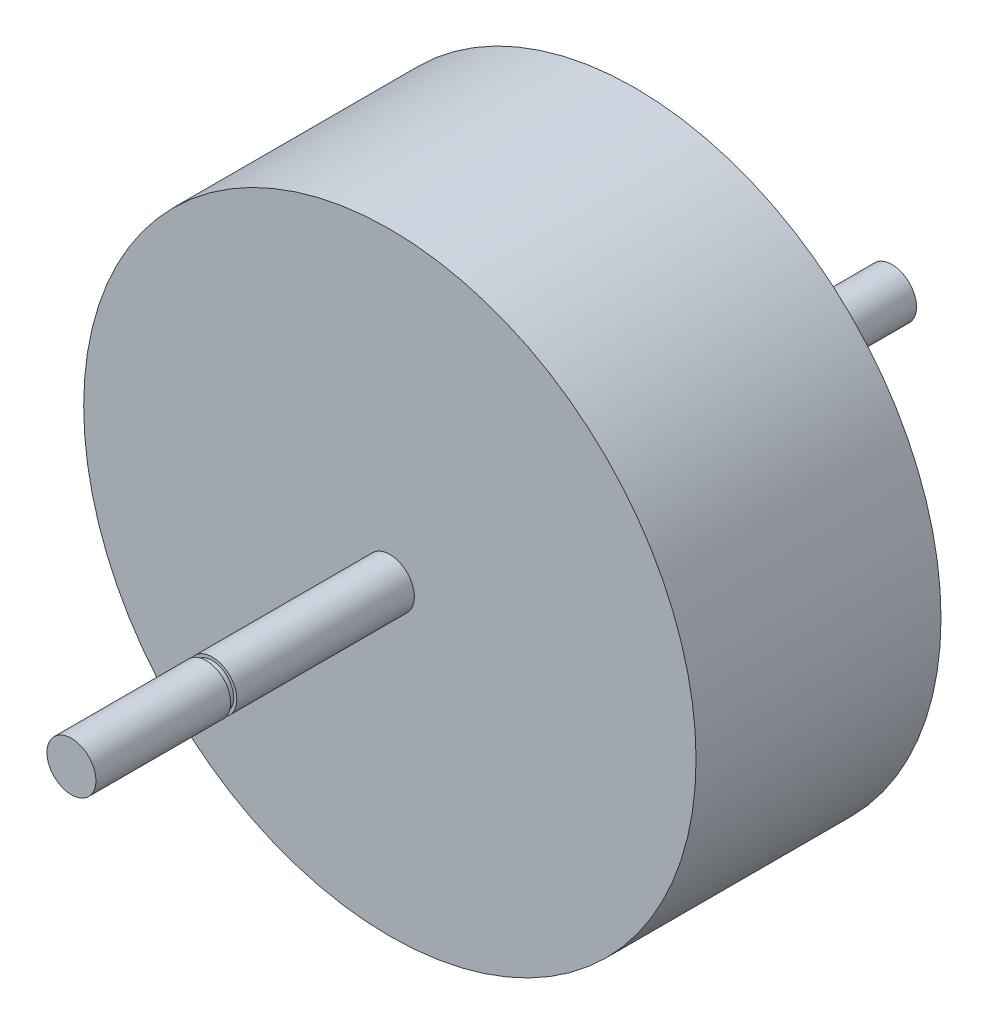
ISO-10303-21;
HEADER;
FILE_DESCRIPTION(('STEP AP214'),'2;1');
FILE_NAME('part.step','',(''),(''),'','','');
FILE_SCHEMA(('AUTOMOTIVE_DESIGN { 1 0 10303 214 1 1 1 1 }'));
ENDSEC;
DATA;
#1=APPLICATION_CONTEXT('core data for automotive mechanical design processes');
#2=APPLICATION_PROTOCOL_DEFINITION('international standard','automotive_design',2000,#1);
#3=PRODUCT_CONTEXT('',#1,'mechanical');
#4=PRODUCT('Part','Part','',(#3));
#5=PRODUCT_RELATED_PRODUCT_CATEGORY('part','',(#4));
#6=PRODUCT_DEFINITION_FORMATION('','',#4);
#7=PRODUCT_DEFINITION_CONTEXT('part definition',#1,'design');
#8=PRODUCT_DEFINITION('design','',#6,#7);
#9=PRODUCT_DEFINITION_SHAPE('','',#8);
#10=(LENGTH_UNIT() NAMED_UNIT(*) SI_UNIT(.MILLI.,.METRE.));
#11=(NAMED_UNIT(*) PLANE_ANGLE_UNIT() SI_UNIT($,.RADIAN.));
#12=(NAMED_UNIT(*) SI_UNIT($,.STERADIAN.) SOLID_ANGLE_UNIT());
#13=UNCERTAINTY_MEASURE_WITH_UNIT(LENGTH_MEASURE(1.E-05),#10,'distance_accuracy_value','');
#14=(GEOMETRIC_REPRESENTATION_CONTEXT(3) GLOBAL_UNCERTAINTY_ASSIGNED_CONTEXT((#13)) GLOBAL_UNIT_ASSIGNED_CONTEXT((#10,
#11,#12)) REPRESENTATION_CONTEXT('',''));
#15=CARTESIAN_POINT('',(0.,0.,0.));
#16=DIRECTION('',(0.,0.,1.));
#17=DIRECTION('',(1.,0.,0.));
#18=AXIS2_PLACEMENT_3D('',#15,#16,#17);
#19=CARTESIAN_POINT('',(0.,0.,-62.));
#20=DIRECTION('',(0.,0.,1.));
#21=DIRECTION('',(1.,0.,0.));
#22=AXIS2_PLACEMENT_3D('',#19,#20,#21);
#23=CYLINDRICAL_SURFACE('',#22,4.);
#24=CARTESIAN_POINT('',(0.,0.,20.));
#25=DIRECTION('',(0.,0.,1.));
#26=DIRECTION('',(1.,0.,0.));
#27=AXIS2_PLACEMENT_3D('',#24,#25,#26);
#28=CIRCLE('',#27,4.);
#29=CARTESIAN_POINT('',(4.,0.,20.));
#30=VERTEX_POINT('',#29);
#31=EDGE_CURVE('E10',#30,#30,#28,.T.);
#32=ORIENTED_EDGE('',*,*,#31,.T.);
#33=EDGE_LOOP('',(#32));
#34=FACE_BOUND('',#33,.T.);
#35=CARTESIAN_POINT('',(0.,0.,49.));
#36=DIRECTION('',(0.,0.,-1.));
#37=DIRECTION('',(-1.,0.,0.));
#38=AXIS2_PLACEMENT_3D('',#35,#36,#37);
#39=CIRCLE('',#38,4.);
#40=CARTESIAN_POINT('',(-4.,0.,49.));
#41=VERTEX_POINT('',#40);
#42=EDGE_CURVE('E76',#41,#41,#39,.T.);
#43=ORIENTED_EDGE('',*,*,#42,.T.);
#44=EDGE_LOOP('',(#43));
#45=FACE_BOUND('',#44,.T.);
#46=ADVANCED_FACE('F34',(#34,#45),#23,.T.);
#47=CARTESIAN_POINT('',(0.,0.,-20.));
#48=DIRECTION('',(0.,0.,1.));
#49=DIRECTION('',(1.,0.,0.));
#50=AXIS2_PLACEMENT_3D('',#47,#48,#49);
#51=CIRCLE('',#50,4.);
#52=CARTESIAN_POINT('',(4.,0.,-20.));
#53=VERTEX_POINT('',#52);
#54=EDGE_CURVE('E38',#53,#53,#51,.T.);
#55=ORIENTED_EDGE('',*,*,#54,.F.);
#56=EDGE_LOOP('',(#55));
#57=FACE_BOUND('',#56,.T.);
#58=CARTESIAN_POINT('',(0.,0.,-49.));
#59=DIRECTION('',(0.,0.,-1.));
#60=DIRECTION('',(-1.,0.,0.));
#61=AXIS2_PLACEMENT_3D('',#58,#59,#60);
#62=CIRCLE('',#61,4.);
#63=CARTESIAN_POINT('',(-4.,0.,-49.));
#64=VERTEX_POINT('',#63);
#65=EDGE_CURVE('E63',#64,#64,#62,.T.);
#66=ORIENTED_EDGE('',*,*,#65,.F.);
#67=EDGE_LOOP('',(#66));
#68=FACE_BOUND('',#67,.T.);
#69=ADVANCED_FACE('F112',(#57,#68),#23,.T.);
#70=CARTESIAN_POINT('',(0.,0.,20.));
#71=DIRECTION('',(0.,0.,-1.));
#72=DIRECTION('',(-1.,0.,0.));
#73=AXIS2_PLACEMENT_3D('',#70,#71,#72);
#74=CYLINDRICAL_SURFACE('',#73,50.);
#75=CARTESIAN_POINT('',(0.,0.,20.));
#76=DIRECTION('',(0.,0.,1.));
#77=DIRECTION('',(1.,0.,0.));
#78=AXIS2_PLACEMENT_3D('',#75,#76,#77);
#79=CIRCLE('',#78,50.);
#80=CARTESIAN_POINT('',(50.,0.,20.));
#81=VERTEX_POINT('',#80);
#82=EDGE_CURVE('E42',#81,#81,#79,.T.);
#83=ORIENTED_EDGE('',*,*,#82,.F.);
#84=EDGE_LOOP('',(#83));
#85=FACE_BOUND('',#84,.T.);
#86=CARTESIAN_POINT('',(0.,0.,-20.));
#87=DIRECTION('',(0.,0.,1.));
#88=DIRECTION('',(1.,0.,0.));
#89=AXIS2_PLACEMENT_3D('',#86,#87,#88);
#90=CIRCLE('',#89,50.);
#91=CARTESIAN_POINT('',(50.,0.,-20.));
#92=VERTEX_POINT('',#91);
#93=EDGE_CURVE('E47',#92,#92,#90,.T.);
#94=ORIENTED_EDGE('',*,*,#93,.T.);
#95=EDGE_LOOP('',(#94));
#96=FACE_BOUND('',#95,.T.);
#97=ADVANCED_FACE('F36',(#85,#96),#74,.T.);
#98=CARTESIAN_POINT('',(0.,0.,20.));
#99=DIRECTION('',(0.,0.,1.));
#100=DIRECTION('',(1.,0.,0.));
#101=AXIS2_PLACEMENT_3D('',#98,#99,#100);
#102=PLANE('',#101);
#103=ORIENTED_EDGE('',*,*,#31,.F.);
#104=EDGE_LOOP('',(#103));
#105=FACE_BOUND('',#104,.T.);
#106=ORIENTED_EDGE('',*,*,#82,.T.);
#107=EDGE_LOOP('',(#106));
#108=FACE_BOUND('',#107,.T.);
#109=ADVANCED_FACE('F158',(#105,#108),#102,.T.);
#110=CARTESIAN_POINT('',(0.,0.,-20.));
#111=DIRECTION('',(0.,0.,1.));
#112=DIRECTION('',(1.,0.,0.));
#113=AXIS2_PLACEMENT_3D('',#110,#111,#112);
#114=PLANE('',#113);
#115=ORIENTED_EDGE('',*,*,#54,.T.);
#116=EDGE_LOOP('',(#115));
#117=FACE_BOUND('',#116,.T.);
#118=ORIENTED_EDGE('',*,*,#93,.F.);
#119=EDGE_LOOP('',(#118));
#120=FACE_BOUND('',#119,.T.);
#121=ADVANCED_FACE('F150',(#117,#120),#114,.F.);
#122=CARTESIAN_POINT('',(0.,0.,-49.));
#123=DIRECTION('',(0.,0.,-1.));
#124=DIRECTION('',(-1.,0.,0.));
#125=AXIS2_PLACEMENT_3D('',#122,#123,#124);
#126=PLANE('',#125);
#127=CARTESIAN_POINT('',(0.,0.,-49.));
#128=DIRECTION('',(0.,0.,-1.));
#129=DIRECTION('',(-1.,0.,0.));
#130=AXIS2_PLACEMENT_3D('',#127,#128,#129);
#131=CIRCLE('',#130,3.5);
#132=CARTESIAN_POINT('',(-3.5,0.,-49.));
#133=VERTEX_POINT('',#132);
#134=EDGE_CURVE('E71',#133,#133,#131,.T.);
#135=ORIENTED_EDGE('',*,*,#134,.F.);
#136=EDGE_LOOP('',(#135));
#137=FACE_BOUND('',#136,.T.);
#138=ORIENTED_EDGE('',*,*,#65,.T.);
#139=EDGE_LOOP('',(#138));
#140=FACE_BOUND('',#139,.T.);
#141=ADVANCED_FACE('F142',(#137,#140),#126,.T.);
#142=CARTESIAN_POINT('',(0.,0.,-50.));
#143=DIRECTION('',(0.,0.,-1.));
#144=DIRECTION('',(-1.,0.,0.));
#145=AXIS2_PLACEMENT_3D('',#142,#143,#144);
#146=PLANE('',#145);
#147=CARTESIAN_POINT('',(0.,0.,-50.));
#148=DIRECTION('',(0.,0.,-1.));
#149=DIRECTION('',(-1.,0.,0.));
#150=AXIS2_PLACEMENT_3D('',#147,#148,#149);
#151=CIRCLE('',#150,3.5);
#152=CARTESIAN_POINT('',(-3.5,0.,-50.));
#153=VERTEX_POINT('',#152);
#154=EDGE_CURVE('E73',#153,#153,#151,.T.);
#155=ORIENTED_EDGE('',*,*,#154,.T.);
#156=EDGE_LOOP('',(#155));
#157=FACE_BOUND('',#156,.T.);
#158=CARTESIAN_POINT('',(0.,0.,-50.));
#159=DIRECTION('',(0.,0.,-1.));
#160=DIRECTION('',(-1.,0.,0.));
#161=AXIS2_PLACEMENT_3D('',#158,#159,#160);
#162=CIRCLE('',#161,4.);
#163=CARTESIAN_POINT('',(-4.,0.,-50.));
#164=VERTEX_POINT('',#163);
#165=EDGE_CURVE('E67',#164,#164,#162,.T.);
#166=ORIENTED_EDGE('',*,*,#165,.F.);
#167=EDGE_LOOP('',(#166));
#168=FACE_BOUND('',#167,.T.);
#169=ADVANCED_FACE('F140',(#157,#168),#146,.F.);
#170=CARTESIAN_POINT('',(0.,0.,-49.));
#171=DIRECTION('',(0.,0.,-1.));
#172=DIRECTION('',(-1.,0.,0.));
#173=AXIS2_PLACEMENT_3D('',#170,#171,#172);
#174=CYLINDRICAL_SURFACE('',#173,3.5);
#175=ORIENTED_EDGE('',*,*,#134,.T.);
#176=EDGE_LOOP('',(#175));
#177=FACE_BOUND('',#176,.T.);
#178=ORIENTED_EDGE('',*,*,#154,.F.);
#179=EDGE_LOOP('',(#178));
#180=FACE_BOUND('',#179,.T.);
#181=ADVANCED_FACE('F136',(#177,#180),#174,.T.);
#182=CARTESIAN_POINT('',(0.,0.,-62.));
#183=DIRECTION('',(0.,0.,1.));
#184=DIRECTION('',(1.,0.,0.));
#185=AXIS2_PLACEMENT_3D('',#182,#183,#184);
#186=PLANE('',#185);
#187=CARTESIAN_POINT('',(0.,0.,-62.));
#188=DIRECTION('',(0.,0.,1.));
#189=DIRECTION('',(1.,0.,0.));
#190=AXIS2_PLACEMENT_3D('',#187,#188,#189);
#191=CIRCLE('',#190,4.);
#192=CARTESIAN_POINT('',(4.,0.,-62.));
#193=VERTEX_POINT('',#192);
#194=EDGE_CURVE('E50',#193,#193,#191,.T.);
#195=ORIENTED_EDGE('',*,*,#194,.F.);
#196=EDGE_LOOP('',(#195));
#197=FACE_BOUND('',#196,.T.);
#198=ADVANCED_FACE('F131',(#197),#186,.F.);
#199=ORIENTED_EDGE('',*,*,#165,.T.);
#200=EDGE_LOOP('',(#199));
#201=FACE_BOUND('',#200,.T.);
#202=ORIENTED_EDGE('',*,*,#194,.T.);
#203=EDGE_LOOP('',(#202));
#204=FACE_BOUND('',#203,.T.);
#205=ADVANCED_FACE('F107',(#201,#204),#23,.T.);
#206=CARTESIAN_POINT('',(0.,0.,49.));
#207=DIRECTION('',(0.,0.,1.));
#208=DIRECTION('',(-1.,0.,0.));
#209=AXIS2_PLACEMENT_3D('',#206,#207,#208);
#210=PLANE('',#209);
#211=ORIENTED_EDGE('',*,*,#42,.F.);
#212=EDGE_LOOP('',(#211));
#213=FACE_BOUND('',#212,.T.);
#214=CARTESIAN_POINT('',(0.,0.,49.));
#215=DIRECTION('',(0.,0.,-1.));
#216=DIRECTION('',(-1.,0.,0.));
#217=AXIS2_PLACEMENT_3D('',#214,#215,#216);
#218=CIRCLE('',#217,3.5);
#219=CARTESIAN_POINT('',(-3.5,0.,49.));
#220=VERTEX_POINT('',#219);
#221=EDGE_CURVE('E82',#220,#220,#218,.T.);
#222=ORIENTED_EDGE('',*,*,#221,.T.);
#223=EDGE_LOOP('',(#222));
#224=FACE_BOUND('',#223,.T.);
#225=ADVANCED_FACE('F91',(#213,#224),#210,.T.);
#226=CARTESIAN_POINT('',(0.,0.,50.));
#227=DIRECTION('',(0.,0.,1.));
#228=DIRECTION('',(-1.,0.,0.));
#229=AXIS2_PLACEMENT_3D('',#226,#227,#228);
#230=PLANE('',#229);
#231=CARTESIAN_POINT('',(0.,0.,50.));
#232=DIRECTION('',(0.,0.,-1.));
#233=DIRECTION('',(-1.,0.,0.));
#234=AXIS2_PLACEMENT_3D('',#231,#232,#233);
#235=CIRCLE('',#234,4.);
#236=CARTESIAN_POINT('',(-4.,0.,50.));
#237=VERTEX_POINT('',#236);
#238=EDGE_CURVE('E79',#237,#237,#235,.T.);
#239=ORIENTED_EDGE('',*,*,#238,.T.);
#240=EDGE_LOOP('',(#239));
#241=FACE_BOUND('',#240,.T.);
#242=CARTESIAN_POINT('',(0.,0.,50.));
#243=DIRECTION('',(0.,0.,-1.));
#244=DIRECTION('',(-1.,0.,0.));
#245=AXIS2_PLACEMENT_3D('',#242,#243,#244);
#246=CIRCLE('',#245,3.5);
#247=CARTESIAN_POINT('',(-3.5,0.,50.));
#248=VERTEX_POINT('',#247);
#249=EDGE_CURVE('E85',#248,#248,#246,.T.);
#250=ORIENTED_EDGE('',*,*,#249,.F.);
#251=EDGE_LOOP('',(#250));
#252=FACE_BOUND('',#251,.T.);
#253=ADVANCED_FACE('F97',(#241,#252),#230,.F.);
#254=CARTESIAN_POINT('',(0.,0.,49.));
#255=DIRECTION('',(0.,0.,1.));
#256=DIRECTION('',(1.,0.,0.));
#257=AXIS2_PLACEMENT_3D('',#254,#255,#256);
#258=CYLINDRICAL_SURFACE('',#257,3.5);
#259=ORIENTED_EDGE('',*,*,#221,.F.);
#260=EDGE_LOOP('',(#259));
#261=FACE_BOUND('',#260,.T.);
#262=ORIENTED_EDGE('',*,*,#249,.T.);
#263=EDGE_LOOP('',(#262));
#264=FACE_BOUND('',#263,.T.);
#265=ADVANCED_FACE('F93',(#261,#264),#258,.T.);
#266=CARTESIAN_POINT('',(0.,0.,72.));
#267=DIRECTION('',(0.,0.,1.));
#268=DIRECTION('',(1.,0.,0.));
#269=AXIS2_PLACEMENT_3D('',#266,#267,#268);
#270=PLANE('',#269);
#271=CARTESIAN_POINT('',(0.,0.,72.));
#272=DIRECTION('',(0.,0.,1.));
#273=DIRECTION('',(1.,0.,0.));
#274=AXIS2_PLACEMENT_3D('',#271,#272,#273);
#275=CIRCLE('',#274,4.);
#276=CARTESIAN_POINT('',(4.,0.,72.));
#277=VERTEX_POINT('',#276);
#278=EDGE_CURVE('E59',#277,#277,#275,.T.);
#279=ORIENTED_EDGE('',*,*,#278,.T.);
#280=EDGE_LOOP('',(#279));
#281=FACE_BOUND('',#280,.T.);
#282=ADVANCED_FACE('F96',(#281),#270,.T.);
#283=ORIENTED_EDGE('',*,*,#238,.F.);
#284=EDGE_LOOP('',(#283));
#285=FACE_BOUND('',#284,.T.);
#286=ORIENTED_EDGE('',*,*,#278,.F.);
#287=EDGE_LOOP('',(#286));
#288=FACE_BOUND('',#287,.T.);
#289=ADVANCED_FACE('F114',(#285,#288),#23,.T.);
#290=CLOSED_SHELL('',(#46,#69,#97,#109,#121,#141,#169,#181,#198,#205,#225,#253,#265,#282,#289));
#291=MANIFOLD_SOLID_BREP('B2',#290);
#292=ADVANCED_BREP_SHAPE_REPRESENTATION('',(#18,#291),#14);
#293=SHAPE_DEFINITION_REPRESENTATION(#9,#292);
ENDSEC;
END-ISO-10303-21;
